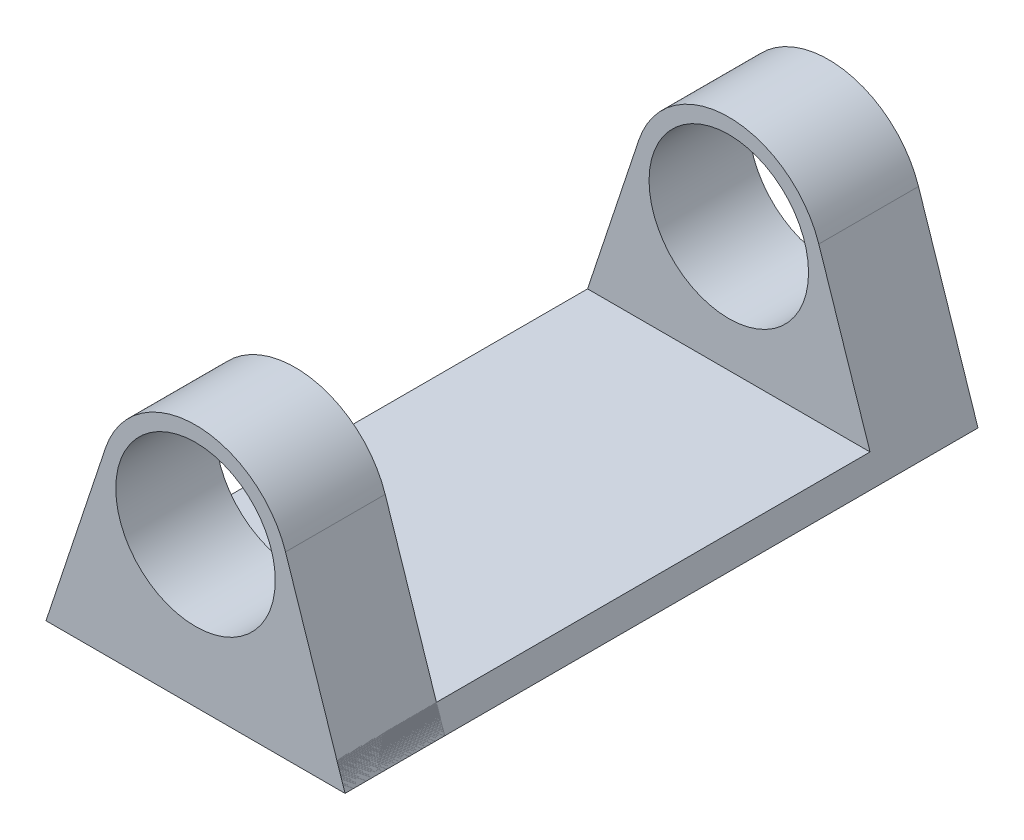
ISO-10303-21;
HEADER;
FILE_DESCRIPTION(('STEP AP214'),'2;1');
FILE_NAME('part.step','',(''),(''),'','','');
FILE_SCHEMA(('AUTOMOTIVE_DESIGN { 1 0 10303 214 1 1 1 1 }'));
ENDSEC;
DATA;
#1=APPLICATION_CONTEXT('core data for automotive mechanical design processes');
#2=APPLICATION_PROTOCOL_DEFINITION('international standard','automotive_design',2000,#1);
#3=PRODUCT_CONTEXT('',#1,'mechanical');
#4=PRODUCT('Part','Part','',(#3));
#5=PRODUCT_RELATED_PRODUCT_CATEGORY('part','',(#4));
#6=PRODUCT_DEFINITION_FORMATION('','',#4);
#7=PRODUCT_DEFINITION_CONTEXT('part definition',#1,'design');
#8=PRODUCT_DEFINITION('design','',#6,#7);
#9=PRODUCT_DEFINITION_SHAPE('','',#8);
#10=(LENGTH_UNIT() NAMED_UNIT(*) SI_UNIT(.MILLI.,.METRE.));
#11=(NAMED_UNIT(*) PLANE_ANGLE_UNIT() SI_UNIT($,.RADIAN.));
#12=(NAMED_UNIT(*) SI_UNIT($,.STERADIAN.) SOLID_ANGLE_UNIT());
#13=UNCERTAINTY_MEASURE_WITH_UNIT(LENGTH_MEASURE(1.E-05),#10,'distance_accuracy_value','');
#14=(GEOMETRIC_REPRESENTATION_CONTEXT(3) GLOBAL_UNCERTAINTY_ASSIGNED_CONTEXT((#13)) GLOBAL_UNIT_ASSIGNED_CONTEXT((#10,
#11,#12)) REPRESENTATION_CONTEXT('',''));
#15=CARTESIAN_POINT('',(0.,0.,0.));
#16=DIRECTION('',(0.,0.,1.));
#17=DIRECTION('',(1.,0.,0.));
#18=AXIS2_PLACEMENT_3D('',#15,#16,#17);
#19=CARTESIAN_POINT('',(-5.,-6.33174393907222,4.3501));
#20=DIRECTION('',(0.,0.,1.));
#21=DIRECTION('',(1.,0.,0.));
#22=AXIS2_PLACEMENT_3D('',#19,#20,#21);
#23=CYLINDRICAL_SURFACE('',#22,0.951419874940785);
#24=CARTESIAN_POINT('',(-5.,-6.33174393907222,5.3501));
#25=DIRECTION('',(0.,0.,1.));
#26=DIRECTION('',(1.,0.,0.));
#27=AXIS2_PLACEMENT_3D('',#24,#25,#26);
#28=CIRCLE('',#27,0.951419874940785);
#29=CARTESIAN_POINT('',(-4.09697069917413,-6.03218115720124,5.3501));
#30=VERTEX_POINT('',#29);
#31=CARTESIAN_POINT('',(-5.90302930082587,-6.03218115720124,5.3501));
#32=VERTEX_POINT('',#31);
#33=EDGE_CURVE('E116',#30,#32,#28,.T.);
#34=ORIENTED_EDGE('',*,*,#33,.F.);
#35=DIRECTION('',(0.,0.,1.));
#36=VECTOR('',#35,1.);
#37=CARTESIAN_POINT('',(-4.09697069917413,-6.03218115720124,4.3501));
#38=LINE('',#37,#36);
#39=CARTESIAN_POINT('',(-4.09697069917413,-6.03218115720124,4.3501));
#40=VERTEX_POINT('',#39);
#41=EDGE_CURVE('E12',#40,#30,#38,.T.);
#42=ORIENTED_EDGE('',*,*,#41,.F.);
#43=CARTESIAN_POINT('',(-5.,-6.33174393907222,4.3501));
#44=DIRECTION('',(0.,0.,1.));
#45=DIRECTION('',(1.,0.,0.));
#46=AXIS2_PLACEMENT_3D('',#43,#44,#45);
#47=CIRCLE('',#46,0.951419874940785);
#48=CARTESIAN_POINT('',(-5.90302930082587,-6.03218115720124,4.3501));
#49=VERTEX_POINT('',#48);
#50=EDGE_CURVE('E109',#40,#49,#47,.T.);
#51=ORIENTED_EDGE('',*,*,#50,.T.);
#52=DIRECTION('',(0.,0.,1.));
#53=VECTOR('',#52,1.);
#54=CARTESIAN_POINT('',(-5.90302930082587,-6.03218115720124,4.3501));
#55=LINE('',#54,#53);
#56=EDGE_CURVE('E54',#49,#32,#55,.T.);
#57=ORIENTED_EDGE('',*,*,#56,.T.);
#58=EDGE_LOOP('',(#34,#42,#51,#57));
#59=FACE_BOUND('',#58,.T.);
#60=ADVANCED_FACE('F51',(#59),#23,.T.);
#61=CARTESIAN_POINT('',(-4.09697069917413,-6.03218115720124,4.3501));
#62=DIRECTION('',(0.949138571319076,0.314858654691884,0.));
#63=DIRECTION('',(-0.314858654691884,0.949138571319076,0.));
#64=AXIS2_PLACEMENT_3D('',#61,#62,#63);
#65=PLANE('',#64);
#66=DIRECTION('',(-0.314858654691884,0.949138571319076,0.));
#67=VECTOR('',#66,1.);
#68=CARTESIAN_POINT('',(-4.09697069917413,-6.03218115720124,5.3501));
#69=LINE('',#68,#67);
#70=CARTESIAN_POINT('',(-3.5,-7.83174393907222,5.3501));
#71=VERTEX_POINT('',#70);
#72=EDGE_CURVE('E111',#71,#30,#69,.T.);
#73=ORIENTED_EDGE('',*,*,#72,.F.);
#74=DIRECTION('',(0.,0.,1.));
#75=VECTOR('',#74,1.);
#76=CARTESIAN_POINT('',(-3.5,-7.83174393907222,4.3501));
#77=LINE('',#76,#75);
#78=CARTESIAN_POINT('',(-3.5,-7.83174393907222,4.3501));
#79=VERTEX_POINT('',#78);
#80=EDGE_CURVE('E60',#79,#71,#77,.T.);
#81=ORIENTED_EDGE('',*,*,#80,.F.);
#82=DIRECTION('',(-0.314858654691884,0.949138571319076,0.));
#83=VECTOR('',#82,1.);
#84=CARTESIAN_POINT('',(-4.09697069917413,-6.03218115720124,4.3501));
#85=LINE('',#84,#83);
#86=EDGE_CURVE('E106',#79,#40,#85,.T.);
#87=ORIENTED_EDGE('',*,*,#86,.T.);
#88=ORIENTED_EDGE('',*,*,#41,.T.);
#89=EDGE_LOOP('',(#73,#81,#87,#88));
#90=FACE_BOUND('',#89,.T.);
#91=ADVANCED_FACE('F127',(#90),#65,.T.);
#92=CARTESIAN_POINT('',(-6.5,-7.83174393907222,4.3501));
#93=DIRECTION('',(0.,-1.,0.));
#94=DIRECTION('',(0.,0.,-1.));
#95=AXIS2_PLACEMENT_3D('',#92,#93,#94);
#96=PLANE('',#95);
#97=DIRECTION('',(1.,0.,0.));
#98=VECTOR('',#97,1.);
#99=CARTESIAN_POINT('',(-6.5,-7.83174393907222,5.3501));
#100=LINE('',#99,#98);
#101=CARTESIAN_POINT('',(-6.5,-7.83174393907222,5.3501));
#102=VERTEX_POINT('',#101);
#103=EDGE_CURVE('E101',#102,#71,#100,.T.);
#104=ORIENTED_EDGE('',*,*,#103,.F.);
#105=DIRECTION('',(0.,0.,1.));
#106=VECTOR('',#105,1.);
#107=CARTESIAN_POINT('',(-6.5,-7.83174393907222,4.3501));
#108=LINE('',#107,#106);
#109=CARTESIAN_POINT('',(-6.5,-7.83174393907222,4.3501));
#110=VERTEX_POINT('',#109);
#111=EDGE_CURVE('E96',#110,#102,#108,.T.);
#112=ORIENTED_EDGE('',*,*,#111,.F.);
#113=DIRECTION('',(1.,0.,0.));
#114=VECTOR('',#113,1.);
#115=CARTESIAN_POINT('',(-6.5,-7.83174393907222,4.3501));
#116=LINE('',#115,#114);
#117=EDGE_CURVE('E99',#110,#79,#116,.T.);
#118=ORIENTED_EDGE('',*,*,#117,.T.);
#119=ORIENTED_EDGE('',*,*,#80,.T.);
#120=EDGE_LOOP('',(#104,#112,#118,#119));
#121=FACE_BOUND('',#120,.T.);
#122=ADVANCED_FACE('F98',(#121),#96,.T.);
#123=CARTESIAN_POINT('',(-5.90302930082587,-6.03218115720124,4.3501));
#124=DIRECTION('',(-0.949138571319075,0.314858654691886,0.));
#125=DIRECTION('',(-0.314858654691886,-0.949138571319075,0.));
#126=AXIS2_PLACEMENT_3D('',#123,#124,#125);
#127=PLANE('',#126);
#128=DIRECTION('',(-0.314858654691887,-0.949138571319075,0.));
#129=VECTOR('',#128,1.);
#130=CARTESIAN_POINT('',(-5.90302930082587,-6.03218115720124,5.3501));
#131=LINE('',#130,#129);
#132=EDGE_CURVE('E119',#32,#102,#131,.T.);
#133=ORIENTED_EDGE('',*,*,#132,.F.);
#134=ORIENTED_EDGE('',*,*,#56,.F.);
#135=DIRECTION('',(-0.314858654691887,-0.949138571319075,0.));
#136=VECTOR('',#135,1.);
#137=CARTESIAN_POINT('',(-5.90302930082587,-6.03218115720124,4.3501));
#138=LINE('',#137,#136);
#139=EDGE_CURVE('E105',#49,#110,#138,.T.);
#140=ORIENTED_EDGE('',*,*,#139,.T.);
#141=ORIENTED_EDGE('',*,*,#111,.T.);
#142=EDGE_LOOP('',(#133,#134,#140,#141));
#143=FACE_BOUND('',#142,.T.);
#144=ADVANCED_FACE('F108',(#143),#127,.T.);
#145=CARTESIAN_POINT('',(-5.,-6.33174393907222,4.3501));
#146=DIRECTION('',(0.,0.,1.));
#147=DIRECTION('',(1.,0.,0.));
#148=AXIS2_PLACEMENT_3D('',#145,#146,#147);
#149=PLANE('',#148);
#150=CARTESIAN_POINT('',(-5.,-6.33174393907222,4.3501));
#151=DIRECTION('',(0.,0.,1.));
#152=DIRECTION('',(1.,0.,0.));
#153=AXIS2_PLACEMENT_3D('',#150,#151,#152);
#154=CIRCLE('',#153,0.8);
#155=CARTESIAN_POINT('',(-4.2,-6.33174393907222,4.3501));
#156=VERTEX_POINT('',#155);
#157=EDGE_CURVE('E120',#156,#156,#154,.T.);
#158=ORIENTED_EDGE('',*,*,#157,.T.);
#159=EDGE_LOOP('',(#158));
#160=FACE_BOUND('',#159,.T.);
#161=ORIENTED_EDGE('',*,*,#50,.F.);
#162=ORIENTED_EDGE('',*,*,#86,.F.);
#163=ORIENTED_EDGE('',*,*,#117,.F.);
#164=ORIENTED_EDGE('',*,*,#139,.F.);
#165=EDGE_LOOP('',(#161,#162,#163,#164));
#166=FACE_BOUND('',#165,.T.);
#167=ADVANCED_FACE('F104',(#160,#166),#149,.F.);
#168=CARTESIAN_POINT('',(-5.,-6.33174393907222,5.3501));
#169=DIRECTION('',(0.,0.,1.));
#170=DIRECTION('',(1.,0.,0.));
#171=AXIS2_PLACEMENT_3D('',#168,#169,#170);
#172=PLANE('',#171);
#173=CARTESIAN_POINT('',(-5.,-6.33174393907222,5.3501));
#174=DIRECTION('',(0.,0.,1.));
#175=DIRECTION('',(1.,0.,0.));
#176=AXIS2_PLACEMENT_3D('',#173,#174,#175);
#177=CIRCLE('',#176,0.8);
#178=CARTESIAN_POINT('',(-4.2,-6.33174393907222,5.3501));
#179=VERTEX_POINT('',#178);
#180=EDGE_CURVE('E157',#179,#179,#177,.T.);
#181=ORIENTED_EDGE('',*,*,#180,.F.);
#182=EDGE_LOOP('',(#181));
#183=FACE_BOUND('',#182,.T.);
#184=ORIENTED_EDGE('',*,*,#33,.T.);
#185=ORIENTED_EDGE('',*,*,#132,.T.);
#186=ORIENTED_EDGE('',*,*,#103,.T.);
#187=ORIENTED_EDGE('',*,*,#72,.T.);
#188=EDGE_LOOP('',(#184,#185,#186,#187));
#189=FACE_BOUND('',#188,.T.);
#190=ADVANCED_FACE('F126',(#183,#189),#172,.T.);
#191=CARTESIAN_POINT('',(-5.,-6.33174393907222,4.3501));
#192=DIRECTION('',(0.,0.,1.));
#193=DIRECTION('',(1.,0.,0.));
#194=AXIS2_PLACEMENT_3D('',#191,#192,#193);
#195=CYLINDRICAL_SURFACE('',#194,0.8);
#196=ORIENTED_EDGE('',*,*,#157,.F.);
#197=EDGE_LOOP('',(#196));
#198=FACE_BOUND('',#197,.T.);
#199=ORIENTED_EDGE('',*,*,#180,.T.);
#200=EDGE_LOOP('',(#199));
#201=FACE_BOUND('',#200,.T.);
#202=ADVANCED_FACE('F145',(#198,#201),#195,.F.);
#203=CLOSED_SHELL('',(#60,#91,#122,#144,#167,#190,#202));
#204=MANIFOLD_SOLID_BREP('B2',#203);
#205=CARTESIAN_POINT('',(-5.,-6.33174393907222,0.0001));
#206=DIRECTION('',(0.,0.,1.));
#207=DIRECTION('',(1.,0.,0.));
#208=AXIS2_PLACEMENT_3D('',#205,#206,#207);
#209=PLANE('',#208);
#210=DIRECTION('',(-1.,0.,0.));
#211=VECTOR('',#210,1.);
#212=CARTESIAN_POINT('',(-5.,-7.58174393907222,0.0001));
#213=LINE('',#212,#211);
#214=CARTESIAN_POINT('',(-3.5829327413842,-7.58174393907222,0.000100000000000273));
#215=VERTEX_POINT('',#214);
#216=CARTESIAN_POINT('',(-6.4170672586158,-7.58174393907222,0.0001));
#217=VERTEX_POINT('',#216);
#218=EDGE_CURVE('E255',#215,#217,#213,.T.);
#219=ORIENTED_EDGE('',*,*,#218,.F.);
#220=DIRECTION('',(-0.314858654691885,0.949138571319076,0.));
#221=VECTOR('',#220,1.);
#222=CARTESIAN_POINT('',(-4.09697069917413,-6.03218115720124,0.0001));
#223=LINE('',#222,#221);
#224=CARTESIAN_POINT('',(-4.09697069917413,-6.03218115720124,0.0001));
#225=VERTEX_POINT('',#224);
#226=EDGE_CURVE('E217',#215,#225,#223,.T.);
#227=ORIENTED_EDGE('',*,*,#226,.T.);
#228=CARTESIAN_POINT('',(-5.,-6.33174393907222,0.0001));
#229=DIRECTION('',(0.,0.,1.));
#230=DIRECTION('',(1.,0.,0.));
#231=AXIS2_PLACEMENT_3D('',#228,#229,#230);
#232=CIRCLE('',#231,0.951419874940786);
#233=CARTESIAN_POINT('',(-5.90302930082587,-6.03218115720124,0.0001));
#234=VERTEX_POINT('',#233);
#235=EDGE_CURVE('E307',#225,#234,#232,.T.);
#236=ORIENTED_EDGE('',*,*,#235,.T.);
#237=DIRECTION('',(-0.314858654691886,-0.949138571319076,0.));
#238=VECTOR('',#237,1.);
#239=CARTESIAN_POINT('',(-5.90302930082587,-6.03218115720124,0.0001));
#240=LINE('',#239,#238);
#241=EDGE_CURVE('E212',#234,#217,#240,.T.);
#242=ORIENTED_EDGE('',*,*,#241,.T.);
#243=EDGE_LOOP('',(#219,#227,#236,#242));
#244=FACE_BOUND('',#243,.T.);
#245=CARTESIAN_POINT('',(-5.,-6.33174393907222,0.0001));
#246=DIRECTION('',(0.,0.,1.));
#247=DIRECTION('',(1.,0.,0.));
#248=AXIS2_PLACEMENT_3D('',#245,#246,#247);
#249=CIRCLE('',#248,0.800000000000001);
#250=CARTESIAN_POINT('',(-4.2,-6.33174393907222,0.0001));
#251=VERTEX_POINT('',#250);
#252=EDGE_CURVE('E303',#251,#251,#249,.T.);
#253=ORIENTED_EDGE('',*,*,#252,.F.);
#254=EDGE_LOOP('',(#253));
#255=FACE_BOUND('',#254,.T.);
#256=ADVANCED_FACE('F196',(#244,#255),#209,.T.);
#257=CARTESIAN_POINT('',(-5.,-6.33174393907222,0.0001));
#258=DIRECTION('',(0.,0.,-1.));
#259=DIRECTION('',(-1.,0.,0.));
#260=AXIS2_PLACEMENT_3D('',#257,#258,#259);
#261=CYLINDRICAL_SURFACE('',#260,0.951419874940786);
#262=DIRECTION('',(0.,0.,-1.));
#263=VECTOR('',#262,1.);
#264=CARTESIAN_POINT('',(-4.09697069917413,-6.03218115720124,0.0001));
#265=LINE('',#264,#263);
#266=CARTESIAN_POINT('',(-4.09697069917413,-6.03218115720124,-1.));
#267=VERTEX_POINT('',#266);
#268=EDGE_CURVE('E314',#225,#267,#265,.T.);
#269=ORIENTED_EDGE('',*,*,#268,.T.);
#270=CARTESIAN_POINT('',(-5.,-6.33174393907222,-1.));
#271=DIRECTION('',(0.,0.,1.));
#272=DIRECTION('',(1.,0.,0.));
#273=AXIS2_PLACEMENT_3D('',#270,#271,#272);
#274=CIRCLE('',#273,0.951419874940786);
#275=CARTESIAN_POINT('',(-5.90302930082587,-6.03218115720124,-1.));
#276=VERTEX_POINT('',#275);
#277=EDGE_CURVE('E288',#267,#276,#274,.T.);
#278=ORIENTED_EDGE('',*,*,#277,.T.);
#279=DIRECTION('',(0.,0.,-1.));
#280=VECTOR('',#279,1.);
#281=CARTESIAN_POINT('',(-5.90302930082587,-6.03218115720124,0.0001));
#282=LINE('',#281,#280);
#283=EDGE_CURVE('E49',#234,#276,#282,.T.);
#284=ORIENTED_EDGE('',*,*,#283,.F.);
#285=ORIENTED_EDGE('',*,*,#235,.F.);
#286=EDGE_LOOP('',(#269,#278,#284,#285));
#287=FACE_BOUND('',#286,.T.);
#288=ADVANCED_FACE('F198',(#287),#261,.T.);
#289=CARTESIAN_POINT('',(-5.90302930082587,-6.03218115720124,0.0001));
#290=DIRECTION('',(0.949138571319076,-0.314858654691886,0.));
#291=DIRECTION('',(0.314858654691886,0.949138571319076,0.));
#292=AXIS2_PLACEMENT_3D('',#289,#290,#291);
#293=PLANE('',#292);
#294=DIRECTION('',(0.,0.,-1.));
#295=VECTOR('',#294,1.);
#296=CARTESIAN_POINT('',(-6.5,-7.83174393907222,0.0001));
#297=LINE('',#296,#295);
#298=CARTESIAN_POINT('',(-6.5,-7.83174393907222,5.35));
#299=VERTEX_POINT('',#298);
#300=CARTESIAN_POINT('',(-6.5,-7.83174393907222,-1.));
#301=VERTEX_POINT('',#300);
#302=EDGE_CURVE('E205',#299,#301,#297,.T.);
#303=ORIENTED_EDGE('',*,*,#302,.F.);
#304=DIRECTION('',(-0.314858654691886,-0.949138571319076,0.));
#305=VECTOR('',#304,1.);
#306=CARTESIAN_POINT('',(-3.51514262705972,1.16608165767405,5.35));
#307=LINE('',#306,#305);
#308=CARTESIAN_POINT('',(-6.4170672586158,-7.58174393907222,5.35));
#309=VERTEX_POINT('',#308);
#310=EDGE_CURVE('E261',#309,#299,#307,.T.);
#311=ORIENTED_EDGE('',*,*,#310,.F.);
#312=DIRECTION('',(0.,0.,-1.));
#313=VECTOR('',#312,1.);
#314=CARTESIAN_POINT('',(-6.4170672586158,-7.58174393907222,5.35));
#315=LINE('',#314,#313);
#316=EDGE_CURVE('E248',#309,#217,#315,.T.);
#317=ORIENTED_EDGE('',*,*,#316,.T.);
#318=ORIENTED_EDGE('',*,*,#241,.F.);
#319=ORIENTED_EDGE('',*,*,#283,.T.);
#320=DIRECTION('',(-0.314858654691886,-0.949138571319076,0.));
#321=VECTOR('',#320,1.);
#322=CARTESIAN_POINT('',(-5.90302930082587,-6.03218115720124,-1.));
#323=LINE('',#322,#321);
#324=EDGE_CURVE('E292',#276,#301,#323,.T.);
#325=ORIENTED_EDGE('',*,*,#324,.T.);
#326=EDGE_LOOP('',(#303,#311,#317,#318,#319,#325));
#327=FACE_BOUND('',#326,.T.);
#328=ADVANCED_FACE('F262',(#327),#293,.F.);
#329=CARTESIAN_POINT('',(-6.5,-7.83174393907222,0.0001));
#330=DIRECTION('',(0.,1.,0.));
#331=DIRECTION('',(0.,0.,1.));
#332=AXIS2_PLACEMENT_3D('',#329,#330,#331);
#333=PLANE('',#332);
#334=ORIENTED_EDGE('',*,*,#302,.T.);
#335=DIRECTION('',(1.,0.,0.));
#336=VECTOR('',#335,1.);
#337=CARTESIAN_POINT('',(-6.5,-7.83174393907222,-1.));
#338=LINE('',#337,#336);
#339=CARTESIAN_POINT('',(-3.5,-7.83174393907222,-1.));
#340=VERTEX_POINT('',#339);
#341=EDGE_CURVE('E295',#301,#340,#338,.T.);
#342=ORIENTED_EDGE('',*,*,#341,.T.);
#343=DIRECTION('',(0.,0.,-1.));
#344=VECTOR('',#343,1.);
#345=CARTESIAN_POINT('',(-3.5,-7.83174393907222,0.0001));
#346=LINE('',#345,#344);
#347=CARTESIAN_POINT('',(-3.5,-7.83174393907222,5.35));
#348=VERTEX_POINT('',#347);
#349=EDGE_CURVE('E317',#348,#340,#346,.T.);
#350=ORIENTED_EDGE('',*,*,#349,.F.);
#351=DIRECTION('',(1.,0.,0.));
#352=VECTOR('',#351,1.);
#353=CARTESIAN_POINT('',(0.,-7.83174393907222,5.35));
#354=LINE('',#353,#352);
#355=EDGE_CURVE('E268',#299,#348,#354,.T.);
#356=ORIENTED_EDGE('',*,*,#355,.F.);
#357=EDGE_LOOP('',(#334,#342,#350,#356));
#358=FACE_BOUND('',#357,.T.);
#359=ADVANCED_FACE('F322',(#358),#333,.F.);
#360=CARTESIAN_POINT('',(-4.09697069917413,-6.03218115720124,0.0001));
#361=DIRECTION('',(-0.949138571319076,-0.314858654691885,0.));
#362=DIRECTION('',(0.314858654691885,-0.949138571319076,0.));
#363=AXIS2_PLACEMENT_3D('',#360,#361,#362);
#364=PLANE('',#363);
#365=ORIENTED_EDGE('',*,*,#226,.F.);
#366=DIRECTION('',(0.,0.,-1.));
#367=VECTOR('',#366,1.);
#368=CARTESIAN_POINT('',(-3.5829327413842,-7.58174393907222,5.35));
#369=LINE('',#368,#367);
#370=CARTESIAN_POINT('',(-3.5829327413842,-7.58174393907222,5.35));
#371=VERTEX_POINT('',#370);
#372=EDGE_CURVE('E258',#371,#215,#369,.T.);
#373=ORIENTED_EDGE('',*,*,#372,.F.);
#374=DIRECTION('',(0.314858654691886,-0.949138571319076,0.));
#375=VECTOR('',#374,1.);
#376=CARTESIAN_POINT('',(-5.49349764859643,-1.82236327914298,5.35));
#377=LINE('',#376,#375);
#378=EDGE_CURVE('E272',#371,#348,#377,.T.);
#379=ORIENTED_EDGE('',*,*,#378,.T.);
#380=ORIENTED_EDGE('',*,*,#349,.T.);
#381=DIRECTION('',(-0.314858654691885,0.949138571319076,0.));
#382=VECTOR('',#381,1.);
#383=CARTESIAN_POINT('',(-4.09697069917413,-6.03218115720124,-1.));
#384=LINE('',#383,#382);
#385=EDGE_CURVE('E299',#340,#267,#384,.T.);
#386=ORIENTED_EDGE('',*,*,#385,.T.);
#387=ORIENTED_EDGE('',*,*,#268,.F.);
#388=EDGE_LOOP('',(#365,#373,#379,#380,#386,#387));
#389=FACE_BOUND('',#388,.T.);
#390=ADVANCED_FACE('F332',(#389),#364,.F.);
#391=CARTESIAN_POINT('',(-5.,-6.33174393907222,0.0001));
#392=DIRECTION('',(0.,0.,-1.));
#393=DIRECTION('',(-1.,0.,0.));
#394=AXIS2_PLACEMENT_3D('',#391,#392,#393);
#395=CYLINDRICAL_SURFACE('',#394,0.800000000000001);
#396=ORIENTED_EDGE('',*,*,#252,.T.);
#397=EDGE_LOOP('',(#396));
#398=FACE_BOUND('',#397,.T.);
#399=CARTESIAN_POINT('',(-5.,-6.33174393907222,-1.));
#400=DIRECTION('',(0.,0.,1.));
#401=DIRECTION('',(1.,0.,0.));
#402=AXIS2_PLACEMENT_3D('',#399,#400,#401);
#403=CIRCLE('',#402,0.800000000000001);
#404=CARTESIAN_POINT('',(-4.2,-6.33174393907222,-1.));
#405=VERTEX_POINT('',#404);
#406=EDGE_CURVE('E284',#405,#405,#403,.T.);
#407=ORIENTED_EDGE('',*,*,#406,.F.);
#408=EDGE_LOOP('',(#407));
#409=FACE_BOUND('',#408,.T.);
#410=ADVANCED_FACE('F338',(#398,#409),#395,.F.);
#411=CARTESIAN_POINT('',(-5.,-6.33174393907222,-1.));
#412=DIRECTION('',(0.,0.,1.));
#413=DIRECTION('',(1.,0.,0.));
#414=AXIS2_PLACEMENT_3D('',#411,#412,#413);
#415=PLANE('',#414);
#416=ORIENTED_EDGE('',*,*,#406,.T.);
#417=EDGE_LOOP('',(#416));
#418=FACE_BOUND('',#417,.T.);
#419=ORIENTED_EDGE('',*,*,#277,.F.);
#420=ORIENTED_EDGE('',*,*,#385,.F.);
#421=ORIENTED_EDGE('',*,*,#341,.F.);
#422=ORIENTED_EDGE('',*,*,#324,.F.);
#423=EDGE_LOOP('',(#419,#420,#421,#422));
#424=FACE_BOUND('',#423,.T.);
#425=ADVANCED_FACE('F327',(#418,#424),#415,.F.);
#426=CARTESIAN_POINT('',(0.,-7.58174393907222,5.35));
#427=DIRECTION('',(0.,1.,0.));
#428=DIRECTION('',(0.,0.,1.));
#429=AXIS2_PLACEMENT_3D('',#426,#427,#428);
#430=PLANE('',#429);
#431=ORIENTED_EDGE('',*,*,#372,.T.);
#432=ORIENTED_EDGE('',*,*,#218,.T.);
#433=ORIENTED_EDGE('',*,*,#316,.F.);
#434=DIRECTION('',(1.,0.,0.));
#435=VECTOR('',#434,1.);
#436=CARTESIAN_POINT('',(0.,-7.58174393907222,5.35));
#437=LINE('',#436,#435);
#438=EDGE_CURVE('E253',#309,#371,#437,.T.);
#439=ORIENTED_EDGE('',*,*,#438,.T.);
#440=EDGE_LOOP('',(#431,#432,#433,#439));
#441=FACE_BOUND('',#440,.T.);
#442=ADVANCED_FACE('F251',(#441),#430,.T.);
#443=CARTESIAN_POINT('',(0.,0.,5.35));
#444=DIRECTION('',(0.,0.,1.));
#445=DIRECTION('',(1.,0.,0.));
#446=AXIS2_PLACEMENT_3D('',#443,#444,#445);
#447=PLANE('',#446);
#448=ORIENTED_EDGE('',*,*,#438,.F.);
#449=ORIENTED_EDGE('',*,*,#310,.T.);
#450=ORIENTED_EDGE('',*,*,#355,.T.);
#451=ORIENTED_EDGE('',*,*,#378,.F.);
#452=EDGE_LOOP('',(#448,#449,#450,#451));
#453=FACE_BOUND('',#452,.T.);
#454=ADVANCED_FACE('F270',(#453),#447,.T.);
#455=CLOSED_SHELL('',(#256,#288,#328,#359,#390,#410,#425,#442,#454));
#456=MANIFOLD_SOLID_BREP('B6',#455);
#457=ADVANCED_BREP_SHAPE_REPRESENTATION('',(#18,#204,#456),#14);
#458=SHAPE_DEFINITION_REPRESENTATION(#9,#457);
ENDSEC;
END-ISO-10303-21;
